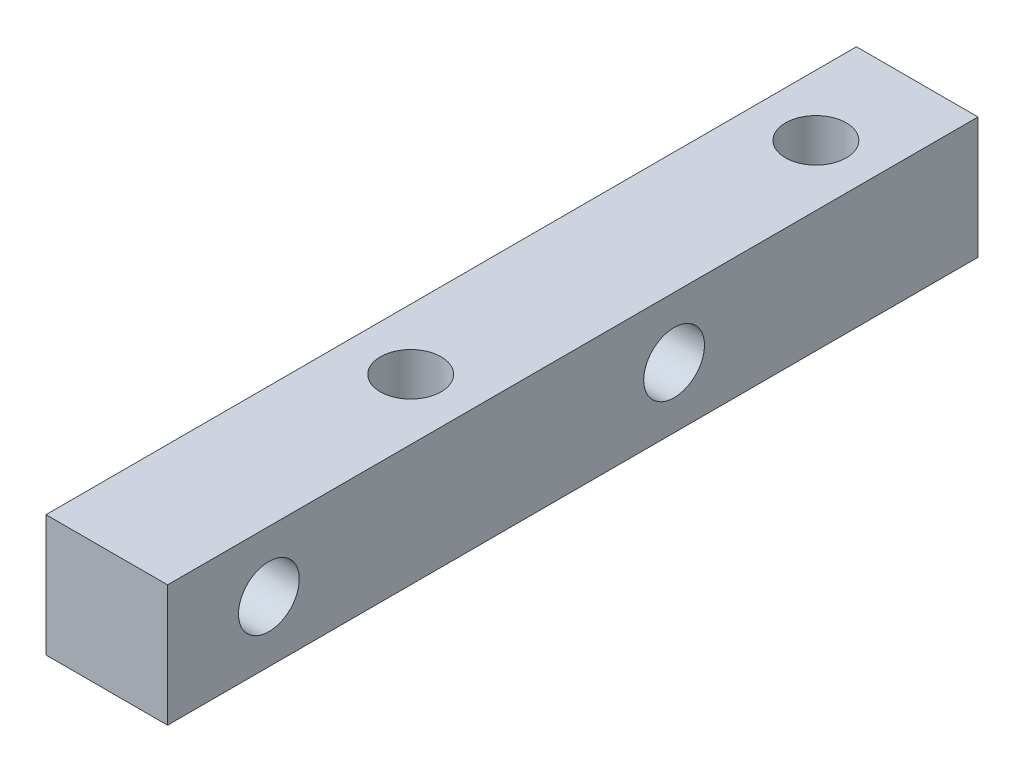
ISO-10303-21;
HEADER;
FILE_DESCRIPTION(('STEP AP214'),'2;1');
FILE_NAME('part.step','',(''),(''),'','','');
FILE_SCHEMA(('AUTOMOTIVE_DESIGN { 1 0 10303 214 1 1 1 1 }'));
ENDSEC;
DATA;
#1=APPLICATION_CONTEXT('core data for automotive mechanical design processes');
#2=APPLICATION_PROTOCOL_DEFINITION('international standard','automotive_design',2000,#1);
#3=PRODUCT_CONTEXT('',#1,'mechanical');
#4=PRODUCT('Part','Part','',(#3));
#5=PRODUCT_RELATED_PRODUCT_CATEGORY('part','',(#4));
#6=PRODUCT_DEFINITION_FORMATION('','',#4);
#7=PRODUCT_DEFINITION_CONTEXT('part definition',#1,'design');
#8=PRODUCT_DEFINITION('design','',#6,#7);
#9=PRODUCT_DEFINITION_SHAPE('','',#8);
#10=(LENGTH_UNIT() NAMED_UNIT(*) SI_UNIT(.MILLI.,.METRE.));
#11=(NAMED_UNIT(*) PLANE_ANGLE_UNIT() SI_UNIT($,.RADIAN.));
#12=(NAMED_UNIT(*) SI_UNIT($,.STERADIAN.) SOLID_ANGLE_UNIT());
#13=UNCERTAINTY_MEASURE_WITH_UNIT(LENGTH_MEASURE(1.E-05),#10,'distance_accuracy_value','');
#14=(GEOMETRIC_REPRESENTATION_CONTEXT(3) GLOBAL_UNCERTAINTY_ASSIGNED_CONTEXT((#13)) GLOBAL_UNIT_ASSIGNED_CONTEXT((#10,
#11,#12)) REPRESENTATION_CONTEXT('',''));
#15=CARTESIAN_POINT('',(0.,0.,0.));
#16=DIRECTION('',(0.,0.,1.));
#17=DIRECTION('',(1.,0.,0.));
#18=AXIS2_PLACEMENT_3D('',#15,#16,#17);
#19=CARTESIAN_POINT('',(3.,-3.,20.));
#20=DIRECTION('',(-1.,0.,0.));
#21=DIRECTION('',(0.,-1.,0.));
#22=AXIS2_PLACEMENT_3D('',#19,#20,#21);
#23=PLANE('',#22);
#24=CARTESIAN_POINT('',(3.,0.,15.));
#25=DIRECTION('',(1.,0.,0.));
#26=DIRECTION('',(0.,1.,0.));
#27=AXIS2_PLACEMENT_3D('',#24,#25,#26);
#28=CIRCLE('',#27,1.5);
#29=CARTESIAN_POINT('',(3.,1.5,15.));
#30=VERTEX_POINT('',#29);
#31=EDGE_CURVE('E130',#30,#30,#28,.T.);
#32=ORIENTED_EDGE('',*,*,#31,.F.);
#33=EDGE_LOOP('',(#32));
#34=FACE_BOUND('',#33,.T.);
#35=CARTESIAN_POINT('',(3.,0.,-5.));
#36=DIRECTION('',(1.,0.,0.));
#37=DIRECTION('',(0.,1.,0.));
#38=AXIS2_PLACEMENT_3D('',#35,#36,#37);
#39=CIRCLE('',#38,1.5);
#40=CARTESIAN_POINT('',(3.,1.5,-5.));
#41=VERTEX_POINT('',#40);
#42=EDGE_CURVE('E122',#41,#41,#39,.T.);
#43=ORIENTED_EDGE('',*,*,#42,.F.);
#44=EDGE_LOOP('',(#43));
#45=FACE_BOUND('',#44,.T.);
#46=DIRECTION('',(0.,1.,0.));
#47=VECTOR('',#46,1.);
#48=CARTESIAN_POINT('',(3.,-3.,-20.));
#49=LINE('',#48,#47);
#50=CARTESIAN_POINT('',(3.,-3.,-20.));
#51=VERTEX_POINT('',#50);
#52=CARTESIAN_POINT('',(3.,3.,-20.));
#53=VERTEX_POINT('',#52);
#54=EDGE_CURVE('E106',#51,#53,#49,.T.);
#55=ORIENTED_EDGE('',*,*,#54,.T.);
#56=DIRECTION('',(0.,0.,-1.));
#57=VECTOR('',#56,1.);
#58=CARTESIAN_POINT('',(3.,3.,20.));
#59=LINE('',#58,#57);
#60=CARTESIAN_POINT('',(3.,3.,20.));
#61=VERTEX_POINT('',#60);
#62=EDGE_CURVE('E11',#61,#53,#59,.T.);
#63=ORIENTED_EDGE('',*,*,#62,.F.);
#64=DIRECTION('',(0.,1.,0.));
#65=VECTOR('',#64,1.);
#66=CARTESIAN_POINT('',(3.,-3.,20.));
#67=LINE('',#66,#65);
#68=CARTESIAN_POINT('',(3.,-3.,20.));
#69=VERTEX_POINT('',#68);
#70=EDGE_CURVE('E94',#69,#61,#67,.T.);
#71=ORIENTED_EDGE('',*,*,#70,.F.);
#72=DIRECTION('',(0.,0.,-1.));
#73=VECTOR('',#72,1.);
#74=CARTESIAN_POINT('',(3.,-3.,20.));
#75=LINE('',#74,#73);
#76=EDGE_CURVE('E105',#69,#51,#75,.T.);
#77=ORIENTED_EDGE('',*,*,#76,.T.);
#78=EDGE_LOOP('',(#55,#63,#71,#77));
#79=FACE_BOUND('',#78,.T.);
#80=ADVANCED_FACE('F43',(#34,#45,#79),#23,.F.);
#81=CARTESIAN_POINT('',(-3.,3.,20.));
#82=DIRECTION('',(0.,-1.,0.));
#83=DIRECTION('',(1.,0.,0.));
#84=AXIS2_PLACEMENT_3D('',#81,#82,#83);
#85=PLANE('',#84);
#86=CARTESIAN_POINT('',(0.,3.,-15.));
#87=DIRECTION('',(0.,1.,0.));
#88=DIRECTION('',(-1.,0.,0.));
#89=AXIS2_PLACEMENT_3D('',#86,#87,#88);
#90=CIRCLE('',#89,1.5);
#91=CARTESIAN_POINT('',(-1.5,3.,-15.));
#92=VERTEX_POINT('',#91);
#93=EDGE_CURVE('E137',#92,#92,#90,.T.);
#94=ORIENTED_EDGE('',*,*,#93,.F.);
#95=EDGE_LOOP('',(#94));
#96=FACE_BOUND('',#95,.T.);
#97=CARTESIAN_POINT('',(0.,3.,5.));
#98=DIRECTION('',(0.,1.,0.));
#99=DIRECTION('',(-1.,0.,0.));
#100=AXIS2_PLACEMENT_3D('',#97,#98,#99);
#101=CIRCLE('',#100,1.5);
#102=CARTESIAN_POINT('',(-1.5,3.,5.));
#103=VERTEX_POINT('',#102);
#104=EDGE_CURVE('E135',#103,#103,#101,.T.);
#105=ORIENTED_EDGE('',*,*,#104,.F.);
#106=EDGE_LOOP('',(#105));
#107=FACE_BOUND('',#106,.T.);
#108=DIRECTION('',(-1.,0.,0.));
#109=VECTOR('',#108,1.);
#110=CARTESIAN_POINT('',(-3.,3.,-20.));
#111=LINE('',#110,#109);
#112=CARTESIAN_POINT('',(-3.,3.,-20.));
#113=VERTEX_POINT('',#112);
#114=EDGE_CURVE('E98',#53,#113,#111,.T.);
#115=ORIENTED_EDGE('',*,*,#114,.T.);
#116=DIRECTION('',(0.,0.,-1.));
#117=VECTOR('',#116,1.);
#118=CARTESIAN_POINT('',(-3.,3.,20.));
#119=LINE('',#118,#117);
#120=CARTESIAN_POINT('',(-3.,3.,20.));
#121=VERTEX_POINT('',#120);
#122=EDGE_CURVE('E51',#121,#113,#119,.T.);
#123=ORIENTED_EDGE('',*,*,#122,.F.);
#124=DIRECTION('',(-1.,0.,0.));
#125=VECTOR('',#124,1.);
#126=CARTESIAN_POINT('',(-3.,3.,20.));
#127=LINE('',#126,#125);
#128=EDGE_CURVE('E90',#61,#121,#127,.T.);
#129=ORIENTED_EDGE('',*,*,#128,.F.);
#130=ORIENTED_EDGE('',*,*,#62,.T.);
#131=EDGE_LOOP('',(#115,#123,#129,#130));
#132=FACE_BOUND('',#131,.T.);
#133=ADVANCED_FACE('F100',(#96,#107,#132),#85,.F.);
#134=CARTESIAN_POINT('',(-3.,-3.,20.));
#135=DIRECTION('',(1.,0.,0.));
#136=DIRECTION('',(0.,0.,-1.));
#137=AXIS2_PLACEMENT_3D('',#134,#135,#136);
#138=PLANE('',#137);
#139=CARTESIAN_POINT('',(-3.,0.,15.));
#140=DIRECTION('',(1.,0.,0.));
#141=DIRECTION('',(0.,1.,0.));
#142=AXIS2_PLACEMENT_3D('',#139,#140,#141);
#143=CIRCLE('',#142,1.5);
#144=CARTESIAN_POINT('',(-3.,1.5,15.));
#145=VERTEX_POINT('',#144);
#146=EDGE_CURVE('E108',#145,#145,#143,.T.);
#147=ORIENTED_EDGE('',*,*,#146,.T.);
#148=EDGE_LOOP('',(#147));
#149=FACE_BOUND('',#148,.T.);
#150=CARTESIAN_POINT('',(-3.,0.,-5.));
#151=DIRECTION('',(1.,0.,0.));
#152=DIRECTION('',(0.,1.,0.));
#153=AXIS2_PLACEMENT_3D('',#150,#151,#152);
#154=CIRCLE('',#153,1.5);
#155=CARTESIAN_POINT('',(-3.,1.5,-5.));
#156=VERTEX_POINT('',#155);
#157=EDGE_CURVE('E120',#156,#156,#154,.T.);
#158=ORIENTED_EDGE('',*,*,#157,.T.);
#159=EDGE_LOOP('',(#158));
#160=FACE_BOUND('',#159,.T.);
#161=DIRECTION('',(0.,-1.,0.));
#162=VECTOR('',#161,1.);
#163=CARTESIAN_POINT('',(-3.,-3.,-20.));
#164=LINE('',#163,#162);
#165=CARTESIAN_POINT('',(-3.,-3.,-20.));
#166=VERTEX_POINT('',#165);
#167=EDGE_CURVE('E76',#113,#166,#164,.T.);
#168=ORIENTED_EDGE('',*,*,#167,.T.);
#169=DIRECTION('',(0.,0.,-1.));
#170=VECTOR('',#169,1.);
#171=CARTESIAN_POINT('',(-3.,-3.,20.));
#172=LINE('',#171,#170);
#173=CARTESIAN_POINT('',(-3.,-3.,20.));
#174=VERTEX_POINT('',#173);
#175=EDGE_CURVE('E97',#174,#166,#172,.T.);
#176=ORIENTED_EDGE('',*,*,#175,.F.);
#177=DIRECTION('',(0.,-1.,0.));
#178=VECTOR('',#177,1.);
#179=CARTESIAN_POINT('',(-3.,-3.,20.));
#180=LINE('',#179,#178);
#181=EDGE_CURVE('E95',#121,#174,#180,.T.);
#182=ORIENTED_EDGE('',*,*,#181,.F.);
#183=ORIENTED_EDGE('',*,*,#122,.T.);
#184=EDGE_LOOP('',(#168,#176,#182,#183));
#185=FACE_BOUND('',#184,.T.);
#186=ADVANCED_FACE('F99',(#149,#160,#185),#138,.F.);
#187=CARTESIAN_POINT('',(-3.,-3.,20.));
#188=DIRECTION('',(0.,1.,0.));
#189=DIRECTION('',(-1.,0.,0.));
#190=AXIS2_PLACEMENT_3D('',#187,#188,#189);
#191=PLANE('',#190);
#192=CARTESIAN_POINT('',(0.,-3.,-15.));
#193=DIRECTION('',(0.,1.,0.));
#194=DIRECTION('',(-1.,0.,0.));
#195=AXIS2_PLACEMENT_3D('',#192,#193,#194);
#196=CIRCLE('',#195,1.5);
#197=CARTESIAN_POINT('',(-1.5,-3.,-15.));
#198=VERTEX_POINT('',#197);
#199=EDGE_CURVE('E125',#198,#198,#196,.T.);
#200=ORIENTED_EDGE('',*,*,#199,.T.);
#201=EDGE_LOOP('',(#200));
#202=FACE_BOUND('',#201,.T.);
#203=CARTESIAN_POINT('',(0.,-3.,5.));
#204=DIRECTION('',(0.,1.,0.));
#205=DIRECTION('',(-1.,0.,0.));
#206=AXIS2_PLACEMENT_3D('',#203,#204,#205);
#207=CIRCLE('',#206,1.5);
#208=CARTESIAN_POINT('',(-1.5,-3.,5.));
#209=VERTEX_POINT('',#208);
#210=EDGE_CURVE('E132',#209,#209,#207,.T.);
#211=ORIENTED_EDGE('',*,*,#210,.T.);
#212=EDGE_LOOP('',(#211));
#213=FACE_BOUND('',#212,.T.);
#214=DIRECTION('',(1.,0.,0.));
#215=VECTOR('',#214,1.);
#216=CARTESIAN_POINT('',(-3.,-3.,-20.));
#217=LINE('',#216,#215);
#218=EDGE_CURVE('E84',#166,#51,#217,.T.);
#219=ORIENTED_EDGE('',*,*,#218,.T.);
#220=ORIENTED_EDGE('',*,*,#76,.F.);
#221=DIRECTION('',(1.,0.,0.));
#222=VECTOR('',#221,1.);
#223=CARTESIAN_POINT('',(-3.,-3.,20.));
#224=LINE('',#223,#222);
#225=EDGE_CURVE('E56',#174,#69,#224,.T.);
#226=ORIENTED_EDGE('',*,*,#225,.F.);
#227=ORIENTED_EDGE('',*,*,#175,.T.);
#228=EDGE_LOOP('',(#219,#220,#226,#227));
#229=FACE_BOUND('',#228,.T.);
#230=ADVANCED_FACE('F111',(#202,#213,#229),#191,.F.);
#231=CARTESIAN_POINT('',(0.,0.,20.));
#232=DIRECTION('',(0.,0.,-1.));
#233=DIRECTION('',(-1.,0.,0.));
#234=AXIS2_PLACEMENT_3D('',#231,#232,#233);
#235=PLANE('',#234);
#236=ORIENTED_EDGE('',*,*,#70,.T.);
#237=ORIENTED_EDGE('',*,*,#128,.T.);
#238=ORIENTED_EDGE('',*,*,#181,.T.);
#239=ORIENTED_EDGE('',*,*,#225,.T.);
#240=EDGE_LOOP('',(#236,#237,#238,#239));
#241=FACE_BOUND('',#240,.T.);
#242=ADVANCED_FACE('F89',(#241),#235,.F.);
#243=CARTESIAN_POINT('',(0.,0.,-20.));
#244=DIRECTION('',(0.,0.,-1.));
#245=DIRECTION('',(-1.,0.,0.));
#246=AXIS2_PLACEMENT_3D('',#243,#244,#245);
#247=PLANE('',#246);
#248=ORIENTED_EDGE('',*,*,#54,.F.);
#249=ORIENTED_EDGE('',*,*,#218,.F.);
#250=ORIENTED_EDGE('',*,*,#167,.F.);
#251=ORIENTED_EDGE('',*,*,#114,.F.);
#252=EDGE_LOOP('',(#248,#249,#250,#251));
#253=FACE_BOUND('',#252,.T.);
#254=ADVANCED_FACE('F117',(#253),#247,.T.);
#255=CARTESIAN_POINT('',(-3.,0.,-5.));
#256=DIRECTION('',(1.,0.,0.));
#257=DIRECTION('',(0.,1.,0.));
#258=AXIS2_PLACEMENT_3D('',#255,#256,#257);
#259=CYLINDRICAL_SURFACE('',#258,1.5);
#260=CARTESIAN_POINT('',(-3.,1.5,-5.));
#261=CARTESIAN_POINT('',(-2.9375,1.5,-5.));
#262=CARTESIAN_POINT('',(-2.875,1.5,-5.));
#263=CARTESIAN_POINT('',(-2.75,1.5,-5.));
#264=CARTESIAN_POINT('',(-2.6875,1.5,-5.));
#265=CARTESIAN_POINT('',(-2.5625,1.5,-5.));
#266=CARTESIAN_POINT('',(-2.5,1.5,-5.));
#267=CARTESIAN_POINT('',(-2.375,1.5,-5.));
#268=CARTESIAN_POINT('',(-2.3125,1.5,-5.));
#269=CARTESIAN_POINT('',(-2.1875,1.5,-5.));
#270=CARTESIAN_POINT('',(-2.125,1.5,-5.));
#271=CARTESIAN_POINT('',(-2.,1.5,-5.));
#272=CARTESIAN_POINT('',(-1.9375,1.5,-5.));
#273=CARTESIAN_POINT('',(-1.8125,1.5,-5.));
#274=CARTESIAN_POINT('',(-1.75,1.5,-5.));
#275=CARTESIAN_POINT('',(-1.625,1.5,-5.));
#276=CARTESIAN_POINT('',(-1.5625,1.5,-5.));
#277=CARTESIAN_POINT('',(-1.4375,1.5,-5.));
#278=CARTESIAN_POINT('',(-1.375,1.5,-5.));
#279=CARTESIAN_POINT('',(-1.25,1.5,-5.));
#280=CARTESIAN_POINT('',(-1.1875,1.5,-5.));
#281=CARTESIAN_POINT('',(-1.0625,1.5,-5.));
#282=CARTESIAN_POINT('',(-1.,1.5,-5.));
#283=CARTESIAN_POINT('',(-0.875000000000002,1.5,-5.));
#284=CARTESIAN_POINT('',(-0.812500000000002,1.5,-5.));
#285=CARTESIAN_POINT('',(-0.687500000000001,1.5,-5.));
#286=CARTESIAN_POINT('',(-0.625000000000001,1.5,-5.));
#287=CARTESIAN_POINT('',(-0.500000000000001,1.5,-5.));
#288=CARTESIAN_POINT('',(-0.437500000000002,1.5,-5.));
#289=CARTESIAN_POINT('',(-0.312500000000002,1.5,-5.));
#290=CARTESIAN_POINT('',(-0.250000000000001,1.5,-5.));
#291=CARTESIAN_POINT('',(-0.125000000000001,1.5,-5.));
#292=CARTESIAN_POINT('',(-0.0625000000000014,1.5,-5.));
#293=CARTESIAN_POINT('',(0.0624999999999988,1.5,-5.));
#294=CARTESIAN_POINT('',(0.124999999999999,1.5,-5.));
#295=CARTESIAN_POINT('',(0.249999999999999,1.5,-5.));
#296=CARTESIAN_POINT('',(0.312499999999999,1.5,-5.));
#297=CARTESIAN_POINT('',(0.437499999999999,1.5,-5.));
#298=CARTESIAN_POINT('',(0.499999999999999,1.5,-5.));
#299=CARTESIAN_POINT('',(0.624999999999999,1.5,-5.));
#300=CARTESIAN_POINT('',(0.687499999999999,1.5,-5.));
#301=CARTESIAN_POINT('',(0.812499999999999,1.5,-5.));
#302=CARTESIAN_POINT('',(0.874999999999999,1.5,-5.));
#303=CARTESIAN_POINT('',(0.999999999999999,1.5,-5.));
#304=CARTESIAN_POINT('',(1.0625,1.5,-5.));
#305=CARTESIAN_POINT('',(1.1875,1.5,-5.));
#306=CARTESIAN_POINT('',(1.25,1.5,-5.));
#307=CARTESIAN_POINT('',(1.375,1.5,-5.));
#308=CARTESIAN_POINT('',(1.4375,1.5,-5.));
#309=CARTESIAN_POINT('',(1.5625,1.5,-5.));
#310=CARTESIAN_POINT('',(1.625,1.5,-5.));
#311=CARTESIAN_POINT('',(1.75,1.5,-5.));
#312=CARTESIAN_POINT('',(1.8125,1.5,-5.));
#313=CARTESIAN_POINT('',(1.9375,1.5,-5.));
#314=CARTESIAN_POINT('',(2.,1.5,-5.));
#315=CARTESIAN_POINT('',(2.125,1.5,-5.));
#316=CARTESIAN_POINT('',(2.1875,1.5,-5.));
#317=CARTESIAN_POINT('',(2.3125,1.5,-5.));
#318=CARTESIAN_POINT('',(2.375,1.5,-5.));
#319=CARTESIAN_POINT('',(2.5,1.5,-5.));
#320=CARTESIAN_POINT('',(2.5625,1.5,-5.));
#321=CARTESIAN_POINT('',(2.6875,1.5,-5.));
#322=CARTESIAN_POINT('',(2.75,1.5,-5.));
#323=CARTESIAN_POINT('',(2.875,1.5,-5.));
#324=CARTESIAN_POINT('',(2.9375,1.5,-5.));
#325=CARTESIAN_POINT('',(3.,1.5,-5.));
#326=B_SPLINE_CURVE_WITH_KNOTS('',3,(#260,#261,#262,#263,#264,#265,#266,#267,#268,#269,#270,
#271,#272,#273,#274,#275,#276,#277,#278,#279,#280,#281,#282,#283,#284,#285,#286,#287,#288,#289,
#290,#291,#292,#293,#294,#295,#296,#297,#298,#299,#300,#301,#302,#303,#304,#305,#306,#307,#308,
#309,#310,#311,#312,#313,#314,#315,#316,#317,#318,#319,#320,#321,#322,#323,#324,#325),
.UNSPECIFIED.,.F.,.F.,(4,2,2,2,2,2,2,2,2,2,2,2,2,2,2,2,2,2,2,2,2,2,2,2,2,2,2,2,2,2,2,2,4),(0.,
0.1875,0.375,0.5625,0.75,0.9375,1.125,1.3125,1.5,1.6875,1.875,2.0625,2.25,2.4375,2.625,2.8125,
3.,3.1875,3.375,3.5625,3.75,3.9375,4.125,4.3125,4.5,4.6875,4.875,5.0625,5.25,5.4375,5.625,
5.8125,6.),.UNSPECIFIED.);
#327=EDGE_CURVE('BSEAM163',#156,#41,#326,.T.);
#328=ORIENTED_EDGE('',*,*,#157,.F.);
#329=ORIENTED_EDGE('',*,*,#42,.T.);
#330=ORIENTED_EDGE('',*,*,#327,.T.);
#331=ORIENTED_EDGE('',*,*,#327,.F.);
#332=EDGE_LOOP('',(#328,#330,#329,#331));
#333=FACE_BOUND('',#332,.T.);
#334=ADVANCED_FACE('F163',(#333),#259,.F.);
#335=CARTESIAN_POINT('',(-3.,0.,15.));
#336=DIRECTION('',(1.,0.,0.));
#337=DIRECTION('',(0.,1.,0.));
#338=AXIS2_PLACEMENT_3D('',#335,#336,#337);
#339=CYLINDRICAL_SURFACE('',#338,1.5);
#340=CARTESIAN_POINT('',(-3.,1.5,15.));
#341=CARTESIAN_POINT('',(-2.9375,1.5,15.));
#342=CARTESIAN_POINT('',(-2.875,1.5,15.));
#343=CARTESIAN_POINT('',(-2.75,1.5,15.));
#344=CARTESIAN_POINT('',(-2.6875,1.5,15.));
#345=CARTESIAN_POINT('',(-2.5625,1.5,15.));
#346=CARTESIAN_POINT('',(-2.5,1.5,15.));
#347=CARTESIAN_POINT('',(-2.375,1.5,15.));
#348=CARTESIAN_POINT('',(-2.3125,1.5,15.));
#349=CARTESIAN_POINT('',(-2.1875,1.5,15.));
#350=CARTESIAN_POINT('',(-2.125,1.5,15.));
#351=CARTESIAN_POINT('',(-2.,1.5,15.));
#352=CARTESIAN_POINT('',(-1.9375,1.5,15.));
#353=CARTESIAN_POINT('',(-1.8125,1.5,15.));
#354=CARTESIAN_POINT('',(-1.75,1.5,15.));
#355=CARTESIAN_POINT('',(-1.625,1.5,15.));
#356=CARTESIAN_POINT('',(-1.5625,1.5,15.));
#357=CARTESIAN_POINT('',(-1.4375,1.5,15.));
#358=CARTESIAN_POINT('',(-1.375,1.5,15.));
#359=CARTESIAN_POINT('',(-1.25,1.5,15.));
#360=CARTESIAN_POINT('',(-1.1875,1.5,15.));
#361=CARTESIAN_POINT('',(-1.0625,1.5,15.));
#362=CARTESIAN_POINT('',(-1.,1.5,15.));
#363=CARTESIAN_POINT('',(-0.875000000000002,1.5,15.));
#364=CARTESIAN_POINT('',(-0.812500000000002,1.5,15.));
#365=CARTESIAN_POINT('',(-0.687500000000001,1.5,15.));
#366=CARTESIAN_POINT('',(-0.625000000000001,1.5,15.));
#367=CARTESIAN_POINT('',(-0.500000000000001,1.5,15.));
#368=CARTESIAN_POINT('',(-0.437500000000002,1.5,15.));
#369=CARTESIAN_POINT('',(-0.312500000000002,1.5,15.));
#370=CARTESIAN_POINT('',(-0.250000000000001,1.5,15.));
#371=CARTESIAN_POINT('',(-0.125000000000001,1.5,15.));
#372=CARTESIAN_POINT('',(-0.0625000000000014,1.5,15.));
#373=CARTESIAN_POINT('',(0.0624999999999988,1.5,15.));
#374=CARTESIAN_POINT('',(0.124999999999999,1.5,15.));
#375=CARTESIAN_POINT('',(0.249999999999999,1.5,15.));
#376=CARTESIAN_POINT('',(0.312499999999999,1.5,15.));
#377=CARTESIAN_POINT('',(0.437499999999999,1.5,15.));
#378=CARTESIAN_POINT('',(0.499999999999999,1.5,15.));
#379=CARTESIAN_POINT('',(0.624999999999999,1.5,15.));
#380=CARTESIAN_POINT('',(0.687499999999999,1.5,15.));
#381=CARTESIAN_POINT('',(0.812499999999999,1.5,15.));
#382=CARTESIAN_POINT('',(0.874999999999999,1.5,15.));
#383=CARTESIAN_POINT('',(0.999999999999999,1.5,15.));
#384=CARTESIAN_POINT('',(1.0625,1.5,15.));
#385=CARTESIAN_POINT('',(1.1875,1.5,15.));
#386=CARTESIAN_POINT('',(1.25,1.5,15.));
#387=CARTESIAN_POINT('',(1.375,1.5,15.));
#388=CARTESIAN_POINT('',(1.4375,1.5,15.));
#389=CARTESIAN_POINT('',(1.5625,1.5,15.));
#390=CARTESIAN_POINT('',(1.625,1.5,15.));
#391=CARTESIAN_POINT('',(1.75,1.5,15.));
#392=CARTESIAN_POINT('',(1.8125,1.5,15.));
#393=CARTESIAN_POINT('',(1.9375,1.5,15.));
#394=CARTESIAN_POINT('',(2.,1.5,15.));
#395=CARTESIAN_POINT('',(2.125,1.5,15.));
#396=CARTESIAN_POINT('',(2.1875,1.5,15.));
#397=CARTESIAN_POINT('',(2.3125,1.5,15.));
#398=CARTESIAN_POINT('',(2.375,1.5,15.));
#399=CARTESIAN_POINT('',(2.5,1.5,15.));
#400=CARTESIAN_POINT('',(2.5625,1.5,15.));
#401=CARTESIAN_POINT('',(2.6875,1.5,15.));
#402=CARTESIAN_POINT('',(2.75,1.5,15.));
#403=CARTESIAN_POINT('',(2.875,1.5,15.));
#404=CARTESIAN_POINT('',(2.9375,1.5,15.));
#405=CARTESIAN_POINT('',(3.,1.5,15.));
#406=B_SPLINE_CURVE_WITH_KNOTS('',3,(#340,#341,#342,#343,#344,#345,#346,#347,#348,#349,#350,
#351,#352,#353,#354,#355,#356,#357,#358,#359,#360,#361,#362,#363,#364,#365,#366,#367,#368,#369,
#370,#371,#372,#373,#374,#375,#376,#377,#378,#379,#380,#381,#382,#383,#384,#385,#386,#387,#388,
#389,#390,#391,#392,#393,#394,#395,#396,#397,#398,#399,#400,#401,#402,#403,#404,#405),
.UNSPECIFIED.,.F.,.F.,(4,2,2,2,2,2,2,2,2,2,2,2,2,2,2,2,2,2,2,2,2,2,2,2,2,2,2,2,2,2,2,2,4),(0.,
0.1875,0.375,0.5625,0.75,0.9375,1.125,1.3125,1.5,1.6875,1.875,2.0625,2.25,2.4375,2.625,2.8125,
3.,3.1875,3.375,3.5625,3.75,3.9375,4.125,4.3125,4.5,4.6875,4.875,5.0625,5.25,5.4375,5.625,
5.8125,6.),.UNSPECIFIED.);
#407=EDGE_CURVE('BSEAM158',#145,#30,#406,.T.);
#408=ORIENTED_EDGE('',*,*,#146,.F.);
#409=ORIENTED_EDGE('',*,*,#31,.T.);
#410=ORIENTED_EDGE('',*,*,#407,.T.);
#411=ORIENTED_EDGE('',*,*,#407,.F.);
#412=EDGE_LOOP('',(#408,#410,#409,#411));
#413=FACE_BOUND('',#412,.T.);
#414=ADVANCED_FACE('F158',(#413),#339,.F.);
#415=CARTESIAN_POINT('',(0.,-3.,5.));
#416=DIRECTION('',(0.,1.,0.));
#417=DIRECTION('',(-1.,0.,0.));
#418=AXIS2_PLACEMENT_3D('',#415,#416,#417);
#419=CYLINDRICAL_SURFACE('',#418,1.5);
#420=ORIENTED_EDGE('',*,*,#210,.F.);
#421=EDGE_LOOP('',(#420));
#422=FACE_BOUND('',#421,.T.);
#423=ORIENTED_EDGE('',*,*,#104,.T.);
#424=EDGE_LOOP('',(#423));
#425=FACE_BOUND('',#424,.T.);
#426=ADVANCED_FACE('F149',(#422,#425),#419,.F.);
#427=CARTESIAN_POINT('',(0.,-3.,-15.));
#428=DIRECTION('',(0.,1.,0.));
#429=DIRECTION('',(-1.,0.,0.));
#430=AXIS2_PLACEMENT_3D('',#427,#428,#429);
#431=CYLINDRICAL_SURFACE('',#430,1.5);
#432=ORIENTED_EDGE('',*,*,#199,.F.);
#433=EDGE_LOOP('',(#432));
#434=FACE_BOUND('',#433,.T.);
#435=ORIENTED_EDGE('',*,*,#93,.T.);
#436=EDGE_LOOP('',(#435));
#437=FACE_BOUND('',#436,.T.);
#438=ADVANCED_FACE('F148',(#434,#437),#431,.F.);
#439=CLOSED_SHELL('',(#80,#133,#186,#230,#242,#254,#334,#414,#426,#438));
#440=MANIFOLD_SOLID_BREP('B2',#439);
#441=ADVANCED_BREP_SHAPE_REPRESENTATION('',(#18,#440),#14);
#442=SHAPE_DEFINITION_REPRESENTATION(#9,#441);
ENDSEC;
END-ISO-10303-21;
